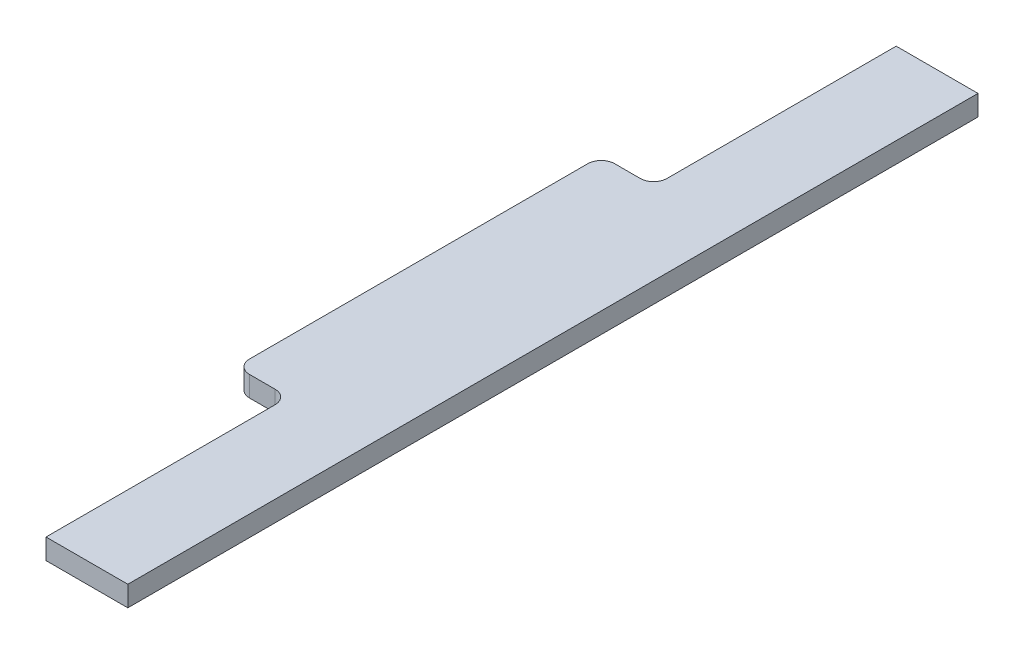
ISO-10303-21;
HEADER;
FILE_DESCRIPTION(('STEP AP214'),'2;1');
FILE_NAME('part.step','',(''),(''),'','','');
FILE_SCHEMA(('AUTOMOTIVE_DESIGN { 1 0 10303 214 1 1 1 1 }'));
ENDSEC;
DATA;
#1=APPLICATION_CONTEXT('core data for automotive mechanical design processes');
#2=APPLICATION_PROTOCOL_DEFINITION('international standard','automotive_design',2000,#1);
#3=PRODUCT_CONTEXT('',#1,'mechanical');
#4=PRODUCT('Part','Part','',(#3));
#5=PRODUCT_RELATED_PRODUCT_CATEGORY('part','',(#4));
#6=PRODUCT_DEFINITION_FORMATION('','',#4);
#7=PRODUCT_DEFINITION_CONTEXT('part definition',#1,'design');
#8=PRODUCT_DEFINITION('design','',#6,#7);
#9=PRODUCT_DEFINITION_SHAPE('','',#8);
#10=(LENGTH_UNIT() NAMED_UNIT(*) SI_UNIT(.MILLI.,.METRE.));
#11=(NAMED_UNIT(*) PLANE_ANGLE_UNIT() SI_UNIT($,.RADIAN.));
#12=(NAMED_UNIT(*) SI_UNIT($,.STERADIAN.) SOLID_ANGLE_UNIT());
#13=UNCERTAINTY_MEASURE_WITH_UNIT(LENGTH_MEASURE(1.E-05),#10,'distance_accuracy_value','');
#14=(GEOMETRIC_REPRESENTATION_CONTEXT(3) GLOBAL_UNCERTAINTY_ASSIGNED_CONTEXT((#13)) GLOBAL_UNIT_ASSIGNED_CONTEXT((#10,
#11,#12)) REPRESENTATION_CONTEXT('',''));
#15=CARTESIAN_POINT('',(0.,0.,0.));
#16=DIRECTION('',(0.,0.,1.));
#17=DIRECTION('',(1.,0.,0.));
#18=AXIS2_PLACEMENT_3D('',#15,#16,#17);
#19=CARTESIAN_POINT('',(0.,38.1,0.));
#20=DIRECTION('',(1.,0.,0.));
#21=DIRECTION('',(0.,0.,-1.));
#22=AXIS2_PLACEMENT_3D('',#19,#20,#21);
#23=PLANE('',#22);
#24=DIRECTION('',(0.,0.,1.));
#25=VECTOR('',#24,1.);
#26=CARTESIAN_POINT('',(0.,0.,0.));
#27=LINE('',#26,#25);
#28=CARTESIAN_POINT('',(0.,0.,-426.75));
#29=VERTEX_POINT('',#28);
#30=CARTESIAN_POINT('',(0.,0.,0.));
#31=VERTEX_POINT('',#30);
#32=EDGE_CURVE('E154',#29,#31,#27,.T.);
#33=ORIENTED_EDGE('',*,*,#32,.T.);
#34=DIRECTION('',(0.,-1.,0.));
#35=VECTOR('',#34,1.);
#36=CARTESIAN_POINT('',(0.,38.1,0.));
#37=LINE('',#36,#35);
#38=CARTESIAN_POINT('',(0.,38.1,0.));
#39=VERTEX_POINT('',#38);
#40=EDGE_CURVE('E11',#39,#31,#37,.T.);
#41=ORIENTED_EDGE('',*,*,#40,.F.);
#42=DIRECTION('',(0.,0.,1.));
#43=VECTOR('',#42,1.);
#44=CARTESIAN_POINT('',(0.,38.1,0.));
#45=LINE('',#44,#43);
#46=CARTESIAN_POINT('',(0.,38.1,-426.75));
#47=VERTEX_POINT('',#46);
#48=EDGE_CURVE('E176',#47,#39,#45,.T.);
#49=ORIENTED_EDGE('',*,*,#48,.F.);
#50=DIRECTION('',(0.,-1.,0.));
#51=VECTOR('',#50,1.);
#52=CARTESIAN_POINT('',(0.,38.1,-426.75));
#53=LINE('',#52,#51);
#54=EDGE_CURVE('E150',#47,#29,#53,.T.);
#55=ORIENTED_EDGE('',*,*,#54,.T.);
#56=EDGE_LOOP('',(#33,#41,#49,#55));
#57=FACE_BOUND('',#56,.T.);
#58=ADVANCED_FACE('F34',(#57),#23,.F.);
#59=CARTESIAN_POINT('',(0.,38.1,0.));
#60=DIRECTION('',(0.,0.,-1.));
#61=DIRECTION('',(-1.,0.,0.));
#62=AXIS2_PLACEMENT_3D('',#59,#60,#61);
#63=PLANE('',#62);
#64=DIRECTION('',(1.,0.,0.));
#65=VECTOR('',#64,1.);
#66=CARTESIAN_POINT('',(0.,0.,0.));
#67=LINE('',#66,#65);
#68=CARTESIAN_POINT('',(152.4,0.,0.));
#69=VERTEX_POINT('',#68);
#70=EDGE_CURVE('E157',#31,#69,#67,.T.);
#71=ORIENTED_EDGE('',*,*,#70,.T.);
#72=DIRECTION('',(0.,-1.,0.));
#73=VECTOR('',#72,1.);
#74=CARTESIAN_POINT('',(152.4,38.1,0.));
#75=LINE('',#74,#73);
#76=CARTESIAN_POINT('',(152.4,38.1,0.));
#77=VERTEX_POINT('',#76);
#78=EDGE_CURVE('E42',#77,#69,#75,.T.);
#79=ORIENTED_EDGE('',*,*,#78,.F.);
#80=DIRECTION('',(1.,0.,0.));
#81=VECTOR('',#80,1.);
#82=CARTESIAN_POINT('',(0.,38.1,0.));
#83=LINE('',#82,#81);
#84=EDGE_CURVE('E105',#39,#77,#83,.T.);
#85=ORIENTED_EDGE('',*,*,#84,.F.);
#86=ORIENTED_EDGE('',*,*,#40,.T.);
#87=EDGE_LOOP('',(#71,#79,#85,#86));
#88=FACE_BOUND('',#87,.T.);
#89=ADVANCED_FACE('F254',(#88),#63,.F.);
#90=CARTESIAN_POINT('',(152.4,38.1,0.));
#91=DIRECTION('',(-1.,0.,0.));
#92=DIRECTION('',(0.,0.,1.));
#93=AXIS2_PLACEMENT_3D('',#90,#91,#92);
#94=PLANE('',#93);
#95=DIRECTION('',(0.,0.,-1.));
#96=VECTOR('',#95,1.);
#97=CARTESIAN_POINT('',(152.4,0.,0.));
#98=LINE('',#97,#96);
#99=CARTESIAN_POINT('',(152.4,0.,-1583.5));
#100=VERTEX_POINT('',#99);
#101=EDGE_CURVE('E159',#69,#100,#98,.T.);
#102=ORIENTED_EDGE('',*,*,#101,.T.);
#103=DIRECTION('',(0.,-1.,0.));
#104=VECTOR('',#103,1.);
#105=CARTESIAN_POINT('',(152.4,38.1,-1583.5));
#106=LINE('',#105,#104);
#107=CARTESIAN_POINT('',(152.4,38.1,-1583.5));
#108=VERTEX_POINT('',#107);
#109=EDGE_CURVE('E195',#108,#100,#106,.T.);
#110=ORIENTED_EDGE('',*,*,#109,.F.);
#111=DIRECTION('',(0.,0.,-1.));
#112=VECTOR('',#111,1.);
#113=CARTESIAN_POINT('',(152.4,38.1,0.));
#114=LINE('',#113,#112);
#115=EDGE_CURVE('E203',#77,#108,#114,.T.);
#116=ORIENTED_EDGE('',*,*,#115,.F.);
#117=ORIENTED_EDGE('',*,*,#78,.T.);
#118=EDGE_LOOP('',(#102,#110,#116,#117));
#119=FACE_BOUND('',#118,.T.);
#120=ADVANCED_FACE('F201',(#119),#94,.F.);
#121=CARTESIAN_POINT('',(-1.93922820644983E-13,38.1,-1583.5));
#122=DIRECTION('',(0.,0.,1.));
#123=DIRECTION('',(1.,0.,0.));
#124=AXIS2_PLACEMENT_3D('',#121,#122,#123);
#125=PLANE('',#124);
#126=DIRECTION('',(-1.,0.,0.));
#127=VECTOR('',#126,1.);
#128=CARTESIAN_POINT('',(-1.93922820644983E-13,0.,-1583.5));
#129=LINE('',#128,#127);
#130=CARTESIAN_POINT('',(-1.93922820644983E-13,0.,-1583.5));
#131=VERTEX_POINT('',#130);
#132=EDGE_CURVE('E161',#100,#131,#129,.T.);
#133=ORIENTED_EDGE('',*,*,#132,.T.);
#134=DIRECTION('',(0.,-1.,0.));
#135=VECTOR('',#134,1.);
#136=CARTESIAN_POINT('',(-1.93922820644983E-13,38.1,-1583.5));
#137=LINE('',#136,#135);
#138=CARTESIAN_POINT('',(-1.93922820644983E-13,38.1,-1583.5));
#139=VERTEX_POINT('',#138);
#140=EDGE_CURVE('E192',#139,#131,#137,.T.);
#141=ORIENTED_EDGE('',*,*,#140,.F.);
#142=DIRECTION('',(-1.,0.,0.));
#143=VECTOR('',#142,1.);
#144=CARTESIAN_POINT('',(-1.93922820644983E-13,38.1,-1583.5));
#145=LINE('',#144,#143);
#146=EDGE_CURVE('E221',#108,#139,#145,.T.);
#147=ORIENTED_EDGE('',*,*,#146,.F.);
#148=ORIENTED_EDGE('',*,*,#109,.T.);
#149=EDGE_LOOP('',(#133,#141,#147,#148));
#150=FACE_BOUND('',#149,.T.);
#151=ADVANCED_FACE('F212',(#150),#125,.F.);
#152=CARTESIAN_POINT('',(0.,38.1,-1156.75));
#153=DIRECTION('',(1.,0.,0.));
#154=DIRECTION('',(0.,0.,-1.));
#155=AXIS2_PLACEMENT_3D('',#152,#153,#154);
#156=PLANE('',#155);
#157=DIRECTION('',(0.,0.,1.));
#158=VECTOR('',#157,1.);
#159=CARTESIAN_POINT('',(0.,0.,-1156.75));
#160=LINE('',#159,#158);
#161=CARTESIAN_POINT('',(0.,0.,-1156.75));
#162=VERTEX_POINT('',#161);
#163=EDGE_CURVE('E163',#131,#162,#160,.T.);
#164=ORIENTED_EDGE('',*,*,#163,.T.);
#165=DIRECTION('',(0.,-1.,0.));
#166=VECTOR('',#165,1.);
#167=CARTESIAN_POINT('',(0.,38.1,-1156.75));
#168=LINE('',#167,#166);
#169=CARTESIAN_POINT('',(0.,38.1,-1156.75));
#170=VERTEX_POINT('',#169);
#171=EDGE_CURVE('E189',#170,#162,#168,.T.);
#172=ORIENTED_EDGE('',*,*,#171,.F.);
#173=DIRECTION('',(0.,0.,1.));
#174=VECTOR('',#173,1.);
#175=CARTESIAN_POINT('',(0.,38.1,-1156.75));
#176=LINE('',#175,#174);
#177=EDGE_CURVE('E218',#139,#170,#176,.T.);
#178=ORIENTED_EDGE('',*,*,#177,.F.);
#179=ORIENTED_EDGE('',*,*,#140,.T.);
#180=EDGE_LOOP('',(#164,#172,#178,#179));
#181=FACE_BOUND('',#180,.T.);
#182=ADVANCED_FACE('F216',(#181),#156,.F.);
#183=CARTESIAN_POINT('',(-25.0000000000001,38.1,-1156.75));
#184=DIRECTION('',(0.,-1.,0.));
#185=DIRECTION('',(0.,0.,-1.));
#186=AXIS2_PLACEMENT_3D('',#183,#184,#185);
#187=CYLINDRICAL_SURFACE('',#186,25.);
#188=CARTESIAN_POINT('',(-25.0000000000001,0.,-1156.75));
#189=DIRECTION('',(0.,-1.,0.));
#190=DIRECTION('',(0.,0.,1.));
#191=AXIS2_PLACEMENT_3D('',#188,#189,#190);
#192=CIRCLE('',#191,25.);
#193=CARTESIAN_POINT('',(-25.0000000000001,0.,-1131.75));
#194=VERTEX_POINT('',#193);
#195=EDGE_CURVE('E165',#162,#194,#192,.T.);
#196=ORIENTED_EDGE('',*,*,#195,.T.);
#197=DIRECTION('',(0.,-1.,0.));
#198=VECTOR('',#197,1.);
#199=CARTESIAN_POINT('',(-25.0000000000001,38.1,-1131.75));
#200=LINE('',#199,#198);
#201=CARTESIAN_POINT('',(-25.0000000000001,38.1,-1131.75));
#202=VERTEX_POINT('',#201);
#203=EDGE_CURVE('E186',#202,#194,#200,.T.);
#204=ORIENTED_EDGE('',*,*,#203,.F.);
#205=CARTESIAN_POINT('',(-25.0000000000001,38.1,-1156.75));
#206=DIRECTION('',(0.,-1.,0.));
#207=DIRECTION('',(0.,0.,1.));
#208=AXIS2_PLACEMENT_3D('',#205,#206,#207);
#209=CIRCLE('',#208,25.);
#210=EDGE_CURVE('E220',#170,#202,#209,.T.);
#211=ORIENTED_EDGE('',*,*,#210,.F.);
#212=ORIENTED_EDGE('',*,*,#171,.T.);
#213=EDGE_LOOP('',(#196,#204,#211,#212));
#214=FACE_BOUND('',#213,.T.);
#215=ADVANCED_FACE('F267',(#214),#187,.F.);
#216=CARTESIAN_POINT('',(-25.0000000000001,38.1,-1131.75));
#217=DIRECTION('',(0.,0.,1.));
#218=DIRECTION('',(1.,0.,0.));
#219=AXIS2_PLACEMENT_3D('',#216,#217,#218);
#220=PLANE('',#219);
#221=DIRECTION('',(-1.,0.,0.));
#222=VECTOR('',#221,1.);
#223=CARTESIAN_POINT('',(-25.0000000000001,0.,-1131.75));
#224=LINE('',#223,#222);
#225=CARTESIAN_POINT('',(-72.6,0.,-1131.75));
#226=VERTEX_POINT('',#225);
#227=EDGE_CURVE('E167',#194,#226,#224,.T.);
#228=ORIENTED_EDGE('',*,*,#227,.T.);
#229=DIRECTION('',(0.,-1.,0.));
#230=VECTOR('',#229,1.);
#231=CARTESIAN_POINT('',(-72.6,38.1,-1131.75));
#232=LINE('',#231,#230);
#233=CARTESIAN_POINT('',(-72.6,38.1,-1131.75));
#234=VERTEX_POINT('',#233);
#235=EDGE_CURVE('E183',#234,#226,#232,.T.);
#236=ORIENTED_EDGE('',*,*,#235,.F.);
#237=DIRECTION('',(-1.,0.,0.));
#238=VECTOR('',#237,1.);
#239=CARTESIAN_POINT('',(-25.0000000000001,38.1,-1131.75));
#240=LINE('',#239,#238);
#241=EDGE_CURVE('E223',#202,#234,#240,.T.);
#242=ORIENTED_EDGE('',*,*,#241,.F.);
#243=ORIENTED_EDGE('',*,*,#203,.T.);
#244=EDGE_LOOP('',(#228,#236,#242,#243));
#245=FACE_BOUND('',#244,.T.);
#246=ADVANCED_FACE('F270',(#245),#220,.F.);
#247=CARTESIAN_POINT('',(-72.6,38.1,-1106.75));
#248=DIRECTION('',(0.,-1.,0.));
#249=DIRECTION('',(0.,0.,-1.));
#250=AXIS2_PLACEMENT_3D('',#247,#248,#249);
#251=CYLINDRICAL_SURFACE('',#250,24.9999999999998);
#252=CARTESIAN_POINT('',(-72.6,0.,-1106.75));
#253=DIRECTION('',(0.,1.,0.));
#254=DIRECTION('',(0.,0.,1.));
#255=AXIS2_PLACEMENT_3D('',#252,#253,#254);
#256=CIRCLE('',#255,24.9999999999998);
#257=CARTESIAN_POINT('',(-97.5999999999998,0.,-1106.75));
#258=VERTEX_POINT('',#257);
#259=EDGE_CURVE('E169',#226,#258,#256,.T.);
#260=ORIENTED_EDGE('',*,*,#259,.T.);
#261=DIRECTION('',(0.,-1.,0.));
#262=VECTOR('',#261,1.);
#263=CARTESIAN_POINT('',(-97.5999999999998,38.1,-1106.75));
#264=LINE('',#263,#262);
#265=CARTESIAN_POINT('',(-97.5999999999998,38.1,-1106.75));
#266=VERTEX_POINT('',#265);
#267=EDGE_CURVE('E180',#266,#258,#264,.T.);
#268=ORIENTED_EDGE('',*,*,#267,.F.);
#269=CARTESIAN_POINT('',(-72.6,38.1,-1106.75));
#270=DIRECTION('',(0.,1.,0.));
#271=DIRECTION('',(0.,0.,1.));
#272=AXIS2_PLACEMENT_3D('',#269,#270,#271);
#273=CIRCLE('',#272,24.9999999999998);
#274=EDGE_CURVE('E229',#234,#266,#273,.T.);
#275=ORIENTED_EDGE('',*,*,#274,.F.);
#276=ORIENTED_EDGE('',*,*,#235,.T.);
#277=EDGE_LOOP('',(#260,#268,#275,#276));
#278=FACE_BOUND('',#277,.T.);
#279=ADVANCED_FACE('F235',(#278),#251,.T.);
#280=CARTESIAN_POINT('',(-97.6,38.1,-1106.75));
#281=DIRECTION('',(1.,0.,0.));
#282=DIRECTION('',(0.,0.,-1.));
#283=AXIS2_PLACEMENT_3D('',#280,#281,#282);
#284=PLANE('',#283);
#285=DIRECTION('',(0.,0.,1.));
#286=VECTOR('',#285,1.);
#287=CARTESIAN_POINT('',(-97.6,0.,-1106.75));
#288=LINE('',#287,#286);
#289=CARTESIAN_POINT('',(-97.5999999999999,0.,-476.75));
#290=VERTEX_POINT('',#289);
#291=EDGE_CURVE('E171',#258,#290,#288,.T.);
#292=ORIENTED_EDGE('',*,*,#291,.T.);
#293=DIRECTION('',(0.,-1.,0.));
#294=VECTOR('',#293,1.);
#295=CARTESIAN_POINT('',(-97.5999999999999,38.1,-476.75));
#296=LINE('',#295,#294);
#297=CARTESIAN_POINT('',(-97.5999999999999,38.1,-476.75));
#298=VERTEX_POINT('',#297);
#299=EDGE_CURVE('E145',#298,#290,#296,.T.);
#300=ORIENTED_EDGE('',*,*,#299,.F.);
#301=DIRECTION('',(0.,0.,1.));
#302=VECTOR('',#301,1.);
#303=CARTESIAN_POINT('',(-97.6,38.1,-1106.75));
#304=LINE('',#303,#302);
#305=EDGE_CURVE('E136',#266,#298,#304,.T.);
#306=ORIENTED_EDGE('',*,*,#305,.F.);
#307=ORIENTED_EDGE('',*,*,#267,.T.);
#308=EDGE_LOOP('',(#292,#300,#306,#307));
#309=FACE_BOUND('',#308,.T.);
#310=ADVANCED_FACE('F239',(#309),#284,.F.);
#311=CARTESIAN_POINT('',(-72.5999999999999,38.1,-476.75));
#312=DIRECTION('',(0.,-1.,0.));
#313=DIRECTION('',(0.,0.,-1.));
#314=AXIS2_PLACEMENT_3D('',#311,#312,#313);
#315=CYLINDRICAL_SURFACE('',#314,24.9999999999998);
#316=CARTESIAN_POINT('',(-72.5999999999999,0.,-476.75));
#317=DIRECTION('',(0.,1.,0.));
#318=DIRECTION('',(0.,0.,-1.));
#319=AXIS2_PLACEMENT_3D('',#316,#317,#318);
#320=CIRCLE('',#319,24.9999999999998);
#321=CARTESIAN_POINT('',(-72.5999999999999,0.,-451.75));
#322=VERTEX_POINT('',#321);
#323=EDGE_CURVE('E144',#290,#322,#320,.T.);
#324=ORIENTED_EDGE('',*,*,#323,.T.);
#325=DIRECTION('',(0.,-1.,0.));
#326=VECTOR('',#325,1.);
#327=CARTESIAN_POINT('',(-72.5999999999999,38.1,-451.75));
#328=LINE('',#327,#326);
#329=CARTESIAN_POINT('',(-72.5999999999999,38.1,-451.75));
#330=VERTEX_POINT('',#329);
#331=EDGE_CURVE('E141',#330,#322,#328,.T.);
#332=ORIENTED_EDGE('',*,*,#331,.F.);
#333=CARTESIAN_POINT('',(-72.5999999999999,38.1,-476.75));
#334=DIRECTION('',(0.,1.,0.));
#335=DIRECTION('',(0.,0.,-1.));
#336=AXIS2_PLACEMENT_3D('',#333,#334,#335);
#337=CIRCLE('',#336,24.9999999999998);
#338=EDGE_CURVE('E130',#298,#330,#337,.T.);
#339=ORIENTED_EDGE('',*,*,#338,.F.);
#340=ORIENTED_EDGE('',*,*,#299,.T.);
#341=EDGE_LOOP('',(#324,#332,#339,#340));
#342=FACE_BOUND('',#341,.T.);
#343=ADVANCED_FACE('F142',(#342),#315,.T.);
#344=CARTESIAN_POINT('',(-25.,38.1,-451.75));
#345=DIRECTION('',(0.,0.,-1.));
#346=DIRECTION('',(-1.,0.,0.));
#347=AXIS2_PLACEMENT_3D('',#344,#345,#346);
#348=PLANE('',#347);
#349=DIRECTION('',(1.,0.,0.));
#350=VECTOR('',#349,1.);
#351=CARTESIAN_POINT('',(-25.,0.,-451.75));
#352=LINE('',#351,#350);
#353=CARTESIAN_POINT('',(-25.,0.,-451.75));
#354=VERTEX_POINT('',#353);
#355=EDGE_CURVE('E91',#322,#354,#352,.T.);
#356=ORIENTED_EDGE('',*,*,#355,.T.);
#357=DIRECTION('',(0.,-1.,0.));
#358=VECTOR('',#357,1.);
#359=CARTESIAN_POINT('',(-25.,38.1,-451.75));
#360=LINE('',#359,#358);
#361=CARTESIAN_POINT('',(-25.,38.1,-451.75));
#362=VERTEX_POINT('',#361);
#363=EDGE_CURVE('E146',#362,#354,#360,.T.);
#364=ORIENTED_EDGE('',*,*,#363,.F.);
#365=DIRECTION('',(1.,0.,0.));
#366=VECTOR('',#365,1.);
#367=CARTESIAN_POINT('',(-25.,38.1,-451.75));
#368=LINE('',#367,#366);
#369=EDGE_CURVE('E134',#330,#362,#368,.T.);
#370=ORIENTED_EDGE('',*,*,#369,.F.);
#371=ORIENTED_EDGE('',*,*,#331,.T.);
#372=EDGE_LOOP('',(#356,#364,#370,#371));
#373=FACE_BOUND('',#372,.T.);
#374=ADVANCED_FACE('F148',(#373),#348,.F.);
#375=CARTESIAN_POINT('',(-25.,38.1,-426.75));
#376=DIRECTION('',(0.,-1.,0.));
#377=DIRECTION('',(0.,0.,-1.));
#378=AXIS2_PLACEMENT_3D('',#375,#376,#377);
#379=CYLINDRICAL_SURFACE('',#378,25.);
#380=CARTESIAN_POINT('',(-25.,0.,-426.75));
#381=DIRECTION('',(0.,-1.,0.));
#382=DIRECTION('',(0.,0.,1.));
#383=AXIS2_PLACEMENT_3D('',#380,#381,#382);
#384=CIRCLE('',#383,25.);
#385=EDGE_CURVE('E97',#354,#29,#384,.T.);
#386=ORIENTED_EDGE('',*,*,#385,.T.);
#387=ORIENTED_EDGE('',*,*,#54,.F.);
#388=CARTESIAN_POINT('',(-25.,38.1,-426.75));
#389=DIRECTION('',(0.,-1.,0.));
#390=DIRECTION('',(0.,0.,1.));
#391=AXIS2_PLACEMENT_3D('',#388,#389,#390);
#392=CIRCLE('',#391,25.);
#393=EDGE_CURVE('E50',#362,#47,#392,.T.);
#394=ORIENTED_EDGE('',*,*,#393,.F.);
#395=ORIENTED_EDGE('',*,*,#363,.T.);
#396=EDGE_LOOP('',(#386,#387,#394,#395));
#397=FACE_BOUND('',#396,.T.);
#398=ADVANCED_FACE('F243',(#397),#379,.F.);
#399=CARTESIAN_POINT('',(-25.,38.1,-426.75));
#400=DIRECTION('',(0.,1.,0.));
#401=DIRECTION('',(0.,0.,1.));
#402=AXIS2_PLACEMENT_3D('',#399,#400,#401);
#403=PLANE('',#402);
#404=ORIENTED_EDGE('',*,*,#48,.T.);
#405=ORIENTED_EDGE('',*,*,#84,.T.);
#406=ORIENTED_EDGE('',*,*,#115,.T.);
#407=ORIENTED_EDGE('',*,*,#146,.T.);
#408=ORIENTED_EDGE('',*,*,#177,.T.);
#409=ORIENTED_EDGE('',*,*,#210,.T.);
#410=ORIENTED_EDGE('',*,*,#241,.T.);
#411=ORIENTED_EDGE('',*,*,#274,.T.);
#412=ORIENTED_EDGE('',*,*,#305,.T.);
#413=ORIENTED_EDGE('',*,*,#338,.T.);
#414=ORIENTED_EDGE('',*,*,#369,.T.);
#415=ORIENTED_EDGE('',*,*,#393,.T.);
#416=EDGE_LOOP('',(#404,#405,#406,#407,#408,#409,#410,#411,#412,#413,#414,#415));
#417=FACE_BOUND('',#416,.T.);
#418=ADVANCED_FACE('F132',(#417),#403,.T.);
#419=CARTESIAN_POINT('',(-25.,0.,-426.75));
#420=DIRECTION('',(0.,1.,0.));
#421=DIRECTION('',(0.,0.,1.));
#422=AXIS2_PLACEMENT_3D('',#419,#420,#421);
#423=PLANE('',#422);
#424=ORIENTED_EDGE('',*,*,#32,.F.);
#425=ORIENTED_EDGE('',*,*,#385,.F.);
#426=ORIENTED_EDGE('',*,*,#355,.F.);
#427=ORIENTED_EDGE('',*,*,#323,.F.);
#428=ORIENTED_EDGE('',*,*,#291,.F.);
#429=ORIENTED_EDGE('',*,*,#259,.F.);
#430=ORIENTED_EDGE('',*,*,#227,.F.);
#431=ORIENTED_EDGE('',*,*,#195,.F.);
#432=ORIENTED_EDGE('',*,*,#163,.F.);
#433=ORIENTED_EDGE('',*,*,#132,.F.);
#434=ORIENTED_EDGE('',*,*,#101,.F.);
#435=ORIENTED_EDGE('',*,*,#70,.F.);
#436=EDGE_LOOP('',(#424,#425,#426,#427,#428,#429,#430,#431,#432,#433,#434,#435));
#437=FACE_BOUND('',#436,.T.);
#438=ADVANCED_FACE('F207',(#437),#423,.F.);
#439=CLOSED_SHELL('',(#58,#89,#120,#151,#182,#215,#246,#279,#310,#343,#374,#398,#418,#438));
#440=MANIFOLD_SOLID_BREP('B2',#439);
#441=ADVANCED_BREP_SHAPE_REPRESENTATION('',(#18,#440),#14);
#442=SHAPE_DEFINITION_REPRESENTATION(#9,#441);
ENDSEC;
END-ISO-10303-21;
